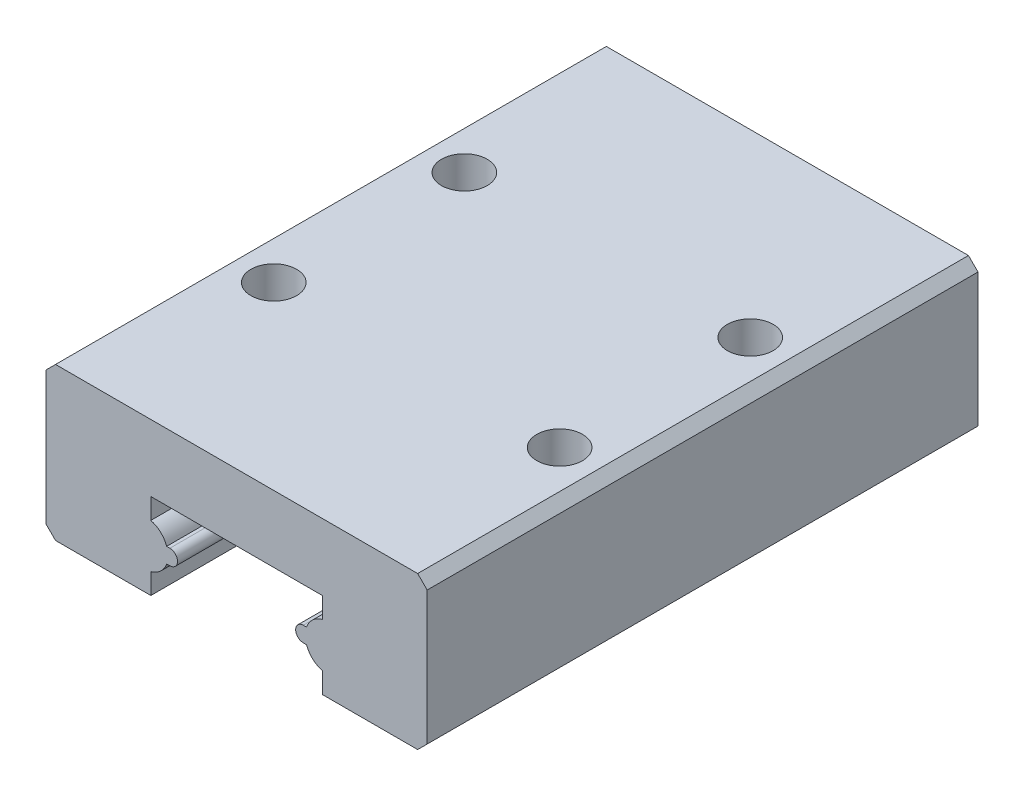
ISO-10303-21;
HEADER;
FILE_DESCRIPTION(('STEP AP214'),'2;1');
FILE_NAME('part.step','',(''),(''),'','','');
FILE_SCHEMA(('AUTOMOTIVE_DESIGN { 1 0 10303 214 1 1 1 1 }'));
ENDSEC;
DATA;
#1=APPLICATION_CONTEXT('core data for automotive mechanical design processes');
#2=APPLICATION_PROTOCOL_DEFINITION('international standard','automotive_design',2000,#1);
#3=PRODUCT_CONTEXT('',#1,'mechanical');
#4=PRODUCT('Part','Part','',(#3));
#5=PRODUCT_RELATED_PRODUCT_CATEGORY('part','',(#4));
#6=PRODUCT_DEFINITION_FORMATION('','',#4);
#7=PRODUCT_DEFINITION_CONTEXT('part definition',#1,'design');
#8=PRODUCT_DEFINITION('design','',#6,#7);
#9=PRODUCT_DEFINITION_SHAPE('','',#8);
#10=(LENGTH_UNIT() NAMED_UNIT(*) SI_UNIT(.MILLI.,.METRE.));
#11=(NAMED_UNIT(*) PLANE_ANGLE_UNIT() SI_UNIT($,.RADIAN.));
#12=(NAMED_UNIT(*) SI_UNIT($,.STERADIAN.) SOLID_ANGLE_UNIT());
#13=UNCERTAINTY_MEASURE_WITH_UNIT(LENGTH_MEASURE(1.E-05),#10,'distance_accuracy_value','');
#14=(GEOMETRIC_REPRESENTATION_CONTEXT(3) GLOBAL_UNCERTAINTY_ASSIGNED_CONTEXT((#13)) GLOBAL_UNIT_ASSIGNED_CONTEXT((#10,
#11,#12)) REPRESENTATION_CONTEXT('',''));
#15=CARTESIAN_POINT('',(0.,0.,0.));
#16=DIRECTION('',(0.,0.,1.));
#17=DIRECTION('',(1.,0.,0.));
#18=AXIS2_PLACEMENT_3D('',#15,#16,#17);
#19=CARTESIAN_POINT('',(14.5,3.41189500386223,28.9));
#20=DIRECTION('',(1.,0.,0.));
#21=DIRECTION('',(0.,1.,0.));
#22=AXIS2_PLACEMENT_3D('',#19,#20,#21);
#23=PLANE('',#22);
#24=DIRECTION('',(0.,-1.,0.));
#25=VECTOR('',#24,1.);
#26=CARTESIAN_POINT('',(14.5,3.41189500386223,0.));
#27=LINE('',#26,#25);
#28=CARTESIAN_POINT('',(14.5,4.5,0.));
#29=VERTEX_POINT('',#28);
#30=CARTESIAN_POINT('',(14.5,3.41189500386223,0.));
#31=VERTEX_POINT('',#30);
#32=EDGE_CURVE('E230',#29,#31,#27,.T.);
#33=ORIENTED_EDGE('',*,*,#32,.T.);
#34=DIRECTION('',(0.,0.,-1.));
#35=VECTOR('',#34,1.);
#36=CARTESIAN_POINT('',(14.5,3.41189500386223,28.9));
#37=LINE('',#36,#35);
#38=CARTESIAN_POINT('',(14.5,3.41189500386223,28.9));
#39=VERTEX_POINT('',#38);
#40=EDGE_CURVE('E11',#39,#31,#37,.T.);
#41=ORIENTED_EDGE('',*,*,#40,.F.);
#42=DIRECTION('',(0.,-1.,0.));
#43=VECTOR('',#42,1.);
#44=CARTESIAN_POINT('',(14.5,3.41189500386223,28.9));
#45=LINE('',#44,#43);
#46=CARTESIAN_POINT('',(14.5,4.5,28.9));
#47=VERTEX_POINT('',#46);
#48=EDGE_CURVE('E277',#47,#39,#45,.T.);
#49=ORIENTED_EDGE('',*,*,#48,.F.);
#50=DIRECTION('',(0.,0.,-1.));
#51=VECTOR('',#50,1.);
#52=CARTESIAN_POINT('',(14.5,4.5,28.9));
#53=LINE('',#52,#51);
#54=EDGE_CURVE('E226',#47,#29,#53,.T.);
#55=ORIENTED_EDGE('',*,*,#54,.T.);
#56=EDGE_LOOP('',(#33,#41,#49,#55));
#57=FACE_BOUND('',#56,.T.);
#58=ADVANCED_FACE('F38',(#57),#23,.F.);
#59=CARTESIAN_POINT('',(14.8,2.25,28.9));
#60=DIRECTION('',(0.,0.,-1.));
#61=DIRECTION('',(-1.,0.,0.));
#62=AXIS2_PLACEMENT_3D('',#59,#60,#61);
#63=CYLINDRICAL_SURFACE('',#62,1.2);
#64=CARTESIAN_POINT('',(14.8,2.25,0.));
#65=DIRECTION('',(0.,0.,1.));
#66=DIRECTION('',(-1.,0.,0.));
#67=AXIS2_PLACEMENT_3D('',#64,#65,#66);
#68=CIRCLE('',#67,1.2);
#69=CARTESIAN_POINT('',(13.6686291501015,2.65,0.));
#70=VERTEX_POINT('',#69);
#71=EDGE_CURVE('E233',#31,#70,#68,.T.);
#72=ORIENTED_EDGE('',*,*,#71,.T.);
#73=DIRECTION('',(0.,0.,-1.));
#74=VECTOR('',#73,1.);
#75=CARTESIAN_POINT('',(13.6686291501015,2.65,28.9));
#76=LINE('',#75,#74);
#77=CARTESIAN_POINT('',(13.6686291501015,2.65,28.9));
#78=VERTEX_POINT('',#77);
#79=EDGE_CURVE('E46',#78,#70,#76,.T.);
#80=ORIENTED_EDGE('',*,*,#79,.F.);
#81=CARTESIAN_POINT('',(14.8,2.25,28.9));
#82=DIRECTION('',(0.,0.,1.));
#83=DIRECTION('',(-1.,0.,0.));
#84=AXIS2_PLACEMENT_3D('',#81,#82,#83);
#85=CIRCLE('',#84,1.2);
#86=EDGE_CURVE('E145',#39,#78,#85,.T.);
#87=ORIENTED_EDGE('',*,*,#86,.F.);
#88=ORIENTED_EDGE('',*,*,#40,.T.);
#89=EDGE_LOOP('',(#72,#80,#87,#88));
#90=FACE_BOUND('',#89,.T.);
#91=ADVANCED_FACE('F415',(#90),#63,.T.);
#92=CARTESIAN_POINT('',(13.5,2.65,28.9));
#93=DIRECTION('',(0.,-1.,0.));
#94=DIRECTION('',(1.,0.,0.));
#95=AXIS2_PLACEMENT_3D('',#92,#93,#94);
#96=PLANE('',#95);
#97=DIRECTION('',(-1.,0.,0.));
#98=VECTOR('',#97,1.);
#99=CARTESIAN_POINT('',(13.5,2.65,0.));
#100=LINE('',#99,#98);
#101=CARTESIAN_POINT('',(13.5,2.65,0.));
#102=VERTEX_POINT('',#101);
#103=EDGE_CURVE('E236',#70,#102,#100,.T.);
#104=ORIENTED_EDGE('',*,*,#103,.T.);
#105=DIRECTION('',(0.,0.,-1.));
#106=VECTOR('',#105,1.);
#107=CARTESIAN_POINT('',(13.5,2.65,28.9));
#108=LINE('',#107,#106);
#109=CARTESIAN_POINT('',(13.5,2.65,28.9));
#110=VERTEX_POINT('',#109);
#111=EDGE_CURVE('E332',#110,#102,#108,.T.);
#112=ORIENTED_EDGE('',*,*,#111,.F.);
#113=DIRECTION('',(-1.,0.,0.));
#114=VECTOR('',#113,1.);
#115=CARTESIAN_POINT('',(13.5,2.65,28.9));
#116=LINE('',#115,#114);
#117=EDGE_CURVE('E340',#78,#110,#116,.T.);
#118=ORIENTED_EDGE('',*,*,#117,.F.);
#119=ORIENTED_EDGE('',*,*,#79,.T.);
#120=EDGE_LOOP('',(#104,#112,#118,#119));
#121=FACE_BOUND('',#120,.T.);
#122=ADVANCED_FACE('F338',(#121),#96,.F.);
#123=CARTESIAN_POINT('',(13.5,2.25,28.9));
#124=DIRECTION('',(0.,0.,-1.));
#125=DIRECTION('',(-1.,0.,0.));
#126=AXIS2_PLACEMENT_3D('',#123,#124,#125);
#127=CYLINDRICAL_SURFACE('',#126,0.4);
#128=CARTESIAN_POINT('',(13.5,2.25,0.));
#129=DIRECTION('',(0.,0.,1.));
#130=DIRECTION('',(-1.,0.,0.));
#131=AXIS2_PLACEMENT_3D('',#128,#129,#130);
#132=CIRCLE('',#131,0.4);
#133=CARTESIAN_POINT('',(13.5,1.85,0.));
#134=VERTEX_POINT('',#133);
#135=EDGE_CURVE('E238',#102,#134,#132,.T.);
#136=ORIENTED_EDGE('',*,*,#135,.T.);
#137=DIRECTION('',(0.,0.,-1.));
#138=VECTOR('',#137,1.);
#139=CARTESIAN_POINT('',(13.5,1.85,28.9));
#140=LINE('',#139,#138);
#141=CARTESIAN_POINT('',(13.5,1.85,28.9));
#142=VERTEX_POINT('',#141);
#143=EDGE_CURVE('E329',#142,#134,#140,.T.);
#144=ORIENTED_EDGE('',*,*,#143,.F.);
#145=CARTESIAN_POINT('',(13.5,2.25,28.9));
#146=DIRECTION('',(0.,0.,1.));
#147=DIRECTION('',(-1.,0.,0.));
#148=AXIS2_PLACEMENT_3D('',#145,#146,#147);
#149=CIRCLE('',#148,0.4);
#150=EDGE_CURVE('E358',#110,#142,#149,.T.);
#151=ORIENTED_EDGE('',*,*,#150,.F.);
#152=ORIENTED_EDGE('',*,*,#111,.T.);
#153=EDGE_LOOP('',(#136,#144,#151,#152));
#154=FACE_BOUND('',#153,.T.);
#155=ADVANCED_FACE('F349',(#154),#127,.T.);
#156=CARTESIAN_POINT('',(13.5,1.85,28.9));
#157=DIRECTION('',(0.,1.,0.));
#158=DIRECTION('',(-1.,0.,0.));
#159=AXIS2_PLACEMENT_3D('',#156,#157,#158);
#160=PLANE('',#159);
#161=DIRECTION('',(1.,0.,0.));
#162=VECTOR('',#161,1.);
#163=CARTESIAN_POINT('',(13.5,1.85,0.));
#164=LINE('',#163,#162);
#165=CARTESIAN_POINT('',(13.6686291501015,1.85,0.));
#166=VERTEX_POINT('',#165);
#167=EDGE_CURVE('E240',#134,#166,#164,.T.);
#168=ORIENTED_EDGE('',*,*,#167,.T.);
#169=DIRECTION('',(0.,0.,-1.));
#170=VECTOR('',#169,1.);
#171=CARTESIAN_POINT('',(13.6686291501015,1.85,28.9));
#172=LINE('',#171,#170);
#173=CARTESIAN_POINT('',(13.6686291501015,1.85,28.9));
#174=VERTEX_POINT('',#173);
#175=EDGE_CURVE('E326',#174,#166,#172,.T.);
#176=ORIENTED_EDGE('',*,*,#175,.F.);
#177=DIRECTION('',(1.,0.,0.));
#178=VECTOR('',#177,1.);
#179=CARTESIAN_POINT('',(13.5,1.85,28.9));
#180=LINE('',#179,#178);
#181=EDGE_CURVE('E355',#142,#174,#180,.T.);
#182=ORIENTED_EDGE('',*,*,#181,.F.);
#183=ORIENTED_EDGE('',*,*,#143,.T.);
#184=EDGE_LOOP('',(#168,#176,#182,#183));
#185=FACE_BOUND('',#184,.T.);
#186=ADVANCED_FACE('F353',(#185),#160,.F.);
#187=CARTESIAN_POINT('',(14.8,2.25,28.9));
#188=DIRECTION('',(0.,0.,-1.));
#189=DIRECTION('',(-1.,0.,0.));
#190=AXIS2_PLACEMENT_3D('',#187,#188,#189);
#191=CYLINDRICAL_SURFACE('',#190,1.2);
#192=CARTESIAN_POINT('',(14.8,2.25,0.));
#193=DIRECTION('',(0.,0.,1.));
#194=DIRECTION('',(-1.,0.,0.));
#195=AXIS2_PLACEMENT_3D('',#192,#193,#194);
#196=CIRCLE('',#195,1.2);
#197=CARTESIAN_POINT('',(14.5,1.08810499613778,0.));
#198=VERTEX_POINT('',#197);
#199=EDGE_CURVE('E242',#166,#198,#196,.T.);
#200=ORIENTED_EDGE('',*,*,#199,.T.);
#201=DIRECTION('',(0.,0.,-1.));
#202=VECTOR('',#201,1.);
#203=CARTESIAN_POINT('',(14.5,1.08810499613778,28.9));
#204=LINE('',#203,#202);
#205=CARTESIAN_POINT('',(14.5,1.08810499613778,28.9));
#206=VERTEX_POINT('',#205);
#207=EDGE_CURVE('E323',#206,#198,#204,.T.);
#208=ORIENTED_EDGE('',*,*,#207,.F.);
#209=CARTESIAN_POINT('',(14.8,2.25,28.9));
#210=DIRECTION('',(0.,0.,1.));
#211=DIRECTION('',(-1.,0.,0.));
#212=AXIS2_PLACEMENT_3D('',#209,#210,#211);
#213=CIRCLE('',#212,1.2);
#214=EDGE_CURVE('E357',#174,#206,#213,.T.);
#215=ORIENTED_EDGE('',*,*,#214,.F.);
#216=ORIENTED_EDGE('',*,*,#175,.T.);
#217=EDGE_LOOP('',(#200,#208,#215,#216));
#218=FACE_BOUND('',#217,.T.);
#219=ADVANCED_FACE('F428',(#218),#191,.T.);
#220=CARTESIAN_POINT('',(14.5,0.,28.9));
#221=DIRECTION('',(1.,0.,0.));
#222=DIRECTION('',(0.,1.,0.));
#223=AXIS2_PLACEMENT_3D('',#220,#221,#222);
#224=PLANE('',#223);
#225=DIRECTION('',(0.,-1.,0.));
#226=VECTOR('',#225,1.);
#227=CARTESIAN_POINT('',(14.5,0.,0.));
#228=LINE('',#227,#226);
#229=CARTESIAN_POINT('',(14.5,0.,0.));
#230=VERTEX_POINT('',#229);
#231=EDGE_CURVE('E244',#198,#230,#228,.T.);
#232=ORIENTED_EDGE('',*,*,#231,.T.);
#233=DIRECTION('',(0.,0.,-1.));
#234=VECTOR('',#233,1.);
#235=CARTESIAN_POINT('',(14.5,0.,28.9));
#236=LINE('',#235,#234);
#237=CARTESIAN_POINT('',(14.5,0.,28.9));
#238=VERTEX_POINT('',#237);
#239=EDGE_CURVE('E320',#238,#230,#236,.T.);
#240=ORIENTED_EDGE('',*,*,#239,.F.);
#241=DIRECTION('',(0.,-1.,0.));
#242=VECTOR('',#241,1.);
#243=CARTESIAN_POINT('',(14.5,0.,28.9));
#244=LINE('',#243,#242);
#245=EDGE_CURVE('E360',#206,#238,#244,.T.);
#246=ORIENTED_EDGE('',*,*,#245,.F.);
#247=ORIENTED_EDGE('',*,*,#207,.T.);
#248=EDGE_LOOP('',(#232,#240,#246,#247));
#249=FACE_BOUND('',#248,.T.);
#250=ADVANCED_FACE('F431',(#249),#224,.F.);
#251=CARTESIAN_POINT('',(19.5,0.,28.9));
#252=DIRECTION('',(0.,1.,0.));
#253=DIRECTION('',(0.,0.,1.));
#254=AXIS2_PLACEMENT_3D('',#251,#252,#253);
#255=PLANE('',#254);
#256=DIRECTION('',(1.,0.,0.));
#257=VECTOR('',#256,1.);
#258=CARTESIAN_POINT('',(19.5,0.,0.));
#259=LINE('',#258,#257);
#260=CARTESIAN_POINT('',(19.5,0.,0.));
#261=VERTEX_POINT('',#260);
#262=EDGE_CURVE('E246',#230,#261,#259,.T.);
#263=ORIENTED_EDGE('',*,*,#262,.T.);
#264=DIRECTION('',(0.,0.,-1.));
#265=VECTOR('',#264,1.);
#266=CARTESIAN_POINT('',(19.5,0.,28.9));
#267=LINE('',#266,#265);
#268=CARTESIAN_POINT('',(19.5,0.,28.9));
#269=VERTEX_POINT('',#268);
#270=EDGE_CURVE('E317',#269,#261,#267,.T.);
#271=ORIENTED_EDGE('',*,*,#270,.F.);
#272=DIRECTION('',(1.,0.,0.));
#273=VECTOR('',#272,1.);
#274=CARTESIAN_POINT('',(19.5,0.,28.9));
#275=LINE('',#274,#273);
#276=EDGE_CURVE('E366',#238,#269,#275,.T.);
#277=ORIENTED_EDGE('',*,*,#276,.F.);
#278=ORIENTED_EDGE('',*,*,#239,.T.);
#279=EDGE_LOOP('',(#263,#271,#277,#278));
#280=FACE_BOUND('',#279,.T.);
#281=ADVANCED_FACE('F435',(#280),#255,.F.);
#282=CARTESIAN_POINT('',(19.5,0.,28.9));
#283=DIRECTION('',(-0.707106781186547,0.707106781186548,0.));
#284=DIRECTION('',(-0.707106781186548,-0.707106781186547,0.));
#285=AXIS2_PLACEMENT_3D('',#282,#283,#284);
#286=PLANE('',#285);
#287=DIRECTION('',(0.707106781186548,0.707106781186547,0.));
#288=VECTOR('',#287,1.);
#289=CARTESIAN_POINT('',(19.5,0.,0.));
#290=LINE('',#289,#288);
#291=CARTESIAN_POINT('',(20.,0.5,0.));
#292=VERTEX_POINT('',#291);
#293=EDGE_CURVE('E248',#261,#292,#290,.T.);
#294=ORIENTED_EDGE('',*,*,#293,.T.);
#295=DIRECTION('',(0.,0.,-1.));
#296=VECTOR('',#295,1.);
#297=CARTESIAN_POINT('',(20.,0.5,28.9));
#298=LINE('',#297,#296);
#299=CARTESIAN_POINT('',(20.,0.5,28.9));
#300=VERTEX_POINT('',#299);
#301=EDGE_CURVE('E314',#300,#292,#298,.T.);
#302=ORIENTED_EDGE('',*,*,#301,.F.);
#303=DIRECTION('',(0.707106781186548,0.707106781186547,0.));
#304=VECTOR('',#303,1.);
#305=CARTESIAN_POINT('',(19.5,0.,28.9));
#306=LINE('',#305,#304);
#307=EDGE_CURVE('E368',#269,#300,#306,.T.);
#308=ORIENTED_EDGE('',*,*,#307,.F.);
#309=ORIENTED_EDGE('',*,*,#270,.T.);
#310=EDGE_LOOP('',(#294,#302,#308,#309));
#311=FACE_BOUND('',#310,.T.);
#312=ADVANCED_FACE('F439',(#311),#286,.F.);
#313=CARTESIAN_POINT('',(20.,0.5,28.9));
#314=DIRECTION('',(-1.,0.,0.));
#315=DIRECTION('',(0.,0.,1.));
#316=AXIS2_PLACEMENT_3D('',#313,#314,#315);
#317=PLANE('',#316);
#318=DIRECTION('',(0.,1.,0.));
#319=VECTOR('',#318,1.);
#320=CARTESIAN_POINT('',(20.,0.5,0.));
#321=LINE('',#320,#319);
#322=CARTESIAN_POINT('',(20.,7.5,0.));
#323=VERTEX_POINT('',#322);
#324=EDGE_CURVE('E250',#292,#323,#321,.T.);
#325=ORIENTED_EDGE('',*,*,#324,.T.);
#326=DIRECTION('',(0.,0.,-1.));
#327=VECTOR('',#326,1.);
#328=CARTESIAN_POINT('',(20.,7.5,28.9));
#329=LINE('',#328,#327);
#330=CARTESIAN_POINT('',(20.,7.5,28.9));
#331=VERTEX_POINT('',#330);
#332=EDGE_CURVE('E311',#331,#323,#329,.T.);
#333=ORIENTED_EDGE('',*,*,#332,.F.);
#334=DIRECTION('',(0.,1.,0.));
#335=VECTOR('',#334,1.);
#336=CARTESIAN_POINT('',(20.,0.5,28.9));
#337=LINE('',#336,#335);
#338=EDGE_CURVE('E370',#300,#331,#337,.T.);
#339=ORIENTED_EDGE('',*,*,#338,.F.);
#340=ORIENTED_EDGE('',*,*,#301,.T.);
#341=EDGE_LOOP('',(#325,#333,#339,#340));
#342=FACE_BOUND('',#341,.T.);
#343=ADVANCED_FACE('F443',(#342),#317,.F.);
#344=CARTESIAN_POINT('',(19.5,8.,28.9));
#345=DIRECTION('',(-0.707106781186549,-0.707106781186546,0.));
#346=DIRECTION('',(0.707106781186546,-0.707106781186549,0.));
#347=AXIS2_PLACEMENT_3D('',#344,#345,#346);
#348=PLANE('',#347);
#349=DIRECTION('',(-0.707106781186546,0.707106781186549,0.));
#350=VECTOR('',#349,1.);
#351=CARTESIAN_POINT('',(19.5,8.,0.));
#352=LINE('',#351,#350);
#353=CARTESIAN_POINT('',(19.5,8.,0.));
#354=VERTEX_POINT('',#353);
#355=EDGE_CURVE('E252',#323,#354,#352,.T.);
#356=ORIENTED_EDGE('',*,*,#355,.T.);
#357=DIRECTION('',(0.,0.,-1.));
#358=VECTOR('',#357,1.);
#359=CARTESIAN_POINT('',(19.5,8.,28.9));
#360=LINE('',#359,#358);
#361=CARTESIAN_POINT('',(19.5,8.,28.9));
#362=VERTEX_POINT('',#361);
#363=EDGE_CURVE('E308',#362,#354,#360,.T.);
#364=ORIENTED_EDGE('',*,*,#363,.F.);
#365=DIRECTION('',(-0.707106781186546,0.707106781186549,0.));
#366=VECTOR('',#365,1.);
#367=CARTESIAN_POINT('',(19.5,8.,28.9));
#368=LINE('',#367,#366);
#369=EDGE_CURVE('E372',#331,#362,#368,.T.);
#370=ORIENTED_EDGE('',*,*,#369,.F.);
#371=ORIENTED_EDGE('',*,*,#332,.T.);
#372=EDGE_LOOP('',(#356,#364,#370,#371));
#373=FACE_BOUND('',#372,.T.);
#374=ADVANCED_FACE('F447',(#373),#348,.F.);
#375=CARTESIAN_POINT('',(0.5,8.,28.9));
#376=DIRECTION('',(0.,-1.,0.));
#377=DIRECTION('',(1.,0.,0.));
#378=AXIS2_PLACEMENT_3D('',#375,#376,#377);
#379=PLANE('',#378);
#380=CARTESIAN_POINT('',(17.5,8.,19.45));
#381=DIRECTION('',(0.,1.,0.));
#382=DIRECTION('',(0.,0.,1.));
#383=AXIS2_PLACEMENT_3D('',#380,#381,#382);
#384=CIRCLE('',#383,1.2);
#385=CARTESIAN_POINT('',(17.5,8.,20.65));
#386=VERTEX_POINT('',#385);
#387=EDGE_CURVE('E610',#386,#386,#384,.T.);
#388=ORIENTED_EDGE('',*,*,#387,.F.);
#389=EDGE_LOOP('',(#388));
#390=FACE_BOUND('',#389,.T.);
#391=CARTESIAN_POINT('',(17.5,8.,9.45));
#392=DIRECTION('',(0.,1.,0.));
#393=DIRECTION('',(0.,0.,1.));
#394=AXIS2_PLACEMENT_3D('',#391,#392,#393);
#395=CIRCLE('',#394,1.2);
#396=CARTESIAN_POINT('',(17.5,8.,10.65));
#397=VERTEX_POINT('',#396);
#398=EDGE_CURVE('E609',#397,#397,#395,.T.);
#399=ORIENTED_EDGE('',*,*,#398,.F.);
#400=EDGE_LOOP('',(#399));
#401=FACE_BOUND('',#400,.T.);
#402=CARTESIAN_POINT('',(2.5,8.,9.45));
#403=DIRECTION('',(0.,1.,0.));
#404=DIRECTION('',(0.,0.,1.));
#405=AXIS2_PLACEMENT_3D('',#402,#403,#404);
#406=CIRCLE('',#405,1.2);
#407=CARTESIAN_POINT('',(2.5,8.,10.65));
#408=VERTEX_POINT('',#407);
#409=EDGE_CURVE('E629',#408,#408,#406,.T.);
#410=ORIENTED_EDGE('',*,*,#409,.F.);
#411=EDGE_LOOP('',(#410));
#412=FACE_BOUND('',#411,.T.);
#413=CARTESIAN_POINT('',(2.5,8.,19.45));
#414=DIRECTION('',(0.,1.,0.));
#415=DIRECTION('',(0.,0.,1.));
#416=AXIS2_PLACEMENT_3D('',#413,#414,#415);
#417=CIRCLE('',#416,1.2);
#418=CARTESIAN_POINT('',(2.5,8.,20.65));
#419=VERTEX_POINT('',#418);
#420=EDGE_CURVE('E621',#419,#419,#417,.T.);
#421=ORIENTED_EDGE('',*,*,#420,.F.);
#422=EDGE_LOOP('',(#421));
#423=FACE_BOUND('',#422,.T.);
#424=DIRECTION('',(-1.,0.,0.));
#425=VECTOR('',#424,1.);
#426=CARTESIAN_POINT('',(0.5,8.,0.));
#427=LINE('',#426,#425);
#428=CARTESIAN_POINT('',(0.5,8.,0.));
#429=VERTEX_POINT('',#428);
#430=EDGE_CURVE('E254',#354,#429,#427,.T.);
#431=ORIENTED_EDGE('',*,*,#430,.T.);
#432=DIRECTION('',(0.,0.,-1.));
#433=VECTOR('',#432,1.);
#434=CARTESIAN_POINT('',(0.5,8.,28.9));
#435=LINE('',#434,#433);
#436=CARTESIAN_POINT('',(0.5,8.,28.9));
#437=VERTEX_POINT('',#436);
#438=EDGE_CURVE('E305',#437,#429,#435,.T.);
#439=ORIENTED_EDGE('',*,*,#438,.F.);
#440=DIRECTION('',(-1.,0.,0.));
#441=VECTOR('',#440,1.);
#442=CARTESIAN_POINT('',(0.5,8.,28.9));
#443=LINE('',#442,#441);
#444=EDGE_CURVE('E374',#362,#437,#443,.T.);
#445=ORIENTED_EDGE('',*,*,#444,.F.);
#446=ORIENTED_EDGE('',*,*,#363,.T.);
#447=EDGE_LOOP('',(#431,#439,#445,#446));
#448=FACE_BOUND('',#447,.T.);
#449=ADVANCED_FACE('F451',(#390,#401,#412,#423,#448),#379,.F.);
#450=CARTESIAN_POINT('',(0.,7.5,28.9));
#451=DIRECTION('',(0.707106781186548,-0.707106781186547,0.));
#452=DIRECTION('',(0.707106781186547,0.707106781186548,0.));
#453=AXIS2_PLACEMENT_3D('',#450,#451,#452);
#454=PLANE('',#453);
#455=DIRECTION('',(-0.707106781186547,-0.707106781186548,0.));
#456=VECTOR('',#455,1.);
#457=CARTESIAN_POINT('',(0.,7.5,0.));
#458=LINE('',#457,#456);
#459=CARTESIAN_POINT('',(0.,7.5,0.));
#460=VERTEX_POINT('',#459);
#461=EDGE_CURVE('E256',#429,#460,#458,.T.);
#462=ORIENTED_EDGE('',*,*,#461,.T.);
#463=DIRECTION('',(0.,0.,-1.));
#464=VECTOR('',#463,1.);
#465=CARTESIAN_POINT('',(0.,7.5,28.9));
#466=LINE('',#465,#464);
#467=CARTESIAN_POINT('',(0.,7.5,28.9));
#468=VERTEX_POINT('',#467);
#469=EDGE_CURVE('E302',#468,#460,#466,.T.);
#470=ORIENTED_EDGE('',*,*,#469,.F.);
#471=DIRECTION('',(-0.707106781186547,-0.707106781186548,0.));
#472=VECTOR('',#471,1.);
#473=CARTESIAN_POINT('',(0.,7.5,28.9));
#474=LINE('',#473,#472);
#475=EDGE_CURVE('E376',#437,#468,#474,.T.);
#476=ORIENTED_EDGE('',*,*,#475,.F.);
#477=ORIENTED_EDGE('',*,*,#438,.T.);
#478=EDGE_LOOP('',(#462,#470,#476,#477));
#479=FACE_BOUND('',#478,.T.);
#480=ADVANCED_FACE('F455',(#479),#454,.F.);
#481=CARTESIAN_POINT('',(0.,0.5,28.9));
#482=DIRECTION('',(1.,0.,0.));
#483=DIRECTION('',(0.,0.,-1.));
#484=AXIS2_PLACEMENT_3D('',#481,#482,#483);
#485=PLANE('',#484);
#486=DIRECTION('',(0.,-1.,0.));
#487=VECTOR('',#486,1.);
#488=CARTESIAN_POINT('',(0.,0.5,0.));
#489=LINE('',#488,#487);
#490=CARTESIAN_POINT('',(0.,0.5,0.));
#491=VERTEX_POINT('',#490);
#492=EDGE_CURVE('E258',#460,#491,#489,.T.);
#493=ORIENTED_EDGE('',*,*,#492,.T.);
#494=DIRECTION('',(0.,0.,-1.));
#495=VECTOR('',#494,1.);
#496=CARTESIAN_POINT('',(0.,0.5,28.9));
#497=LINE('',#496,#495);
#498=CARTESIAN_POINT('',(0.,0.5,28.9));
#499=VERTEX_POINT('',#498);
#500=EDGE_CURVE('E299',#499,#491,#497,.T.);
#501=ORIENTED_EDGE('',*,*,#500,.F.);
#502=DIRECTION('',(0.,-1.,0.));
#503=VECTOR('',#502,1.);
#504=CARTESIAN_POINT('',(0.,0.5,28.9));
#505=LINE('',#504,#503);
#506=EDGE_CURVE('E378',#468,#499,#505,.T.);
#507=ORIENTED_EDGE('',*,*,#506,.F.);
#508=ORIENTED_EDGE('',*,*,#469,.T.);
#509=EDGE_LOOP('',(#493,#501,#507,#508));
#510=FACE_BOUND('',#509,.T.);
#511=ADVANCED_FACE('F459',(#510),#485,.F.);
#512=CARTESIAN_POINT('',(0.,0.5,28.9));
#513=DIRECTION('',(0.707106781186548,0.707106781186548,0.));
#514=DIRECTION('',(-0.707106781186548,0.707106781186548,0.));
#515=AXIS2_PLACEMENT_3D('',#512,#513,#514);
#516=PLANE('',#515);
#517=DIRECTION('',(0.707106781186548,-0.707106781186548,0.));
#518=VECTOR('',#517,1.);
#519=CARTESIAN_POINT('',(0.,0.5,0.));
#520=LINE('',#519,#518);
#521=CARTESIAN_POINT('',(0.5,0.,0.));
#522=VERTEX_POINT('',#521);
#523=EDGE_CURVE('E260',#491,#522,#520,.T.);
#524=ORIENTED_EDGE('',*,*,#523,.T.);
#525=DIRECTION('',(0.,0.,-1.));
#526=VECTOR('',#525,1.);
#527=CARTESIAN_POINT('',(0.5,0.,28.9));
#528=LINE('',#527,#526);
#529=CARTESIAN_POINT('',(0.5,0.,28.9));
#530=VERTEX_POINT('',#529);
#531=EDGE_CURVE('E296',#530,#522,#528,.T.);
#532=ORIENTED_EDGE('',*,*,#531,.F.);
#533=DIRECTION('',(0.707106781186548,-0.707106781186548,0.));
#534=VECTOR('',#533,1.);
#535=CARTESIAN_POINT('',(0.,0.5,28.9));
#536=LINE('',#535,#534);
#537=EDGE_CURVE('E380',#499,#530,#536,.T.);
#538=ORIENTED_EDGE('',*,*,#537,.F.);
#539=ORIENTED_EDGE('',*,*,#500,.T.);
#540=EDGE_LOOP('',(#524,#532,#538,#539));
#541=FACE_BOUND('',#540,.T.);
#542=ADVANCED_FACE('F463',(#541),#516,.F.);
#543=CARTESIAN_POINT('',(0.5,0.,28.9));
#544=DIRECTION('',(0.,1.,0.));
#545=DIRECTION('',(-1.,0.,0.));
#546=AXIS2_PLACEMENT_3D('',#543,#544,#545);
#547=PLANE('',#546);
#548=DIRECTION('',(1.,0.,0.));
#549=VECTOR('',#548,1.);
#550=CARTESIAN_POINT('',(0.5,0.,0.));
#551=LINE('',#550,#549);
#552=CARTESIAN_POINT('',(5.5,0.,0.));
#553=VERTEX_POINT('',#552);
#554=EDGE_CURVE('E262',#522,#553,#551,.T.);
#555=ORIENTED_EDGE('',*,*,#554,.T.);
#556=DIRECTION('',(0.,0.,-1.));
#557=VECTOR('',#556,1.);
#558=CARTESIAN_POINT('',(5.5,0.,28.9));
#559=LINE('',#558,#557);
#560=CARTESIAN_POINT('',(5.5,0.,28.9));
#561=VERTEX_POINT('',#560);
#562=EDGE_CURVE('E293',#561,#553,#559,.T.);
#563=ORIENTED_EDGE('',*,*,#562,.F.);
#564=DIRECTION('',(1.,0.,0.));
#565=VECTOR('',#564,1.);
#566=CARTESIAN_POINT('',(0.5,0.,28.9));
#567=LINE('',#566,#565);
#568=EDGE_CURVE('E382',#530,#561,#567,.T.);
#569=ORIENTED_EDGE('',*,*,#568,.F.);
#570=ORIENTED_EDGE('',*,*,#531,.T.);
#571=EDGE_LOOP('',(#555,#563,#569,#570));
#572=FACE_BOUND('',#571,.T.);
#573=ADVANCED_FACE('F467',(#572),#547,.F.);
#574=CARTESIAN_POINT('',(5.5,1.08810499613778,28.9));
#575=DIRECTION('',(-1.,0.,0.));
#576=DIRECTION('',(0.,-1.,0.));
#577=AXIS2_PLACEMENT_3D('',#574,#575,#576);
#578=PLANE('',#577);
#579=DIRECTION('',(0.,1.,0.));
#580=VECTOR('',#579,1.);
#581=CARTESIAN_POINT('',(5.5,1.08810499613778,0.));
#582=LINE('',#581,#580);
#583=CARTESIAN_POINT('',(5.5,1.08810499613778,0.));
#584=VERTEX_POINT('',#583);
#585=EDGE_CURVE('E264',#553,#584,#582,.T.);
#586=ORIENTED_EDGE('',*,*,#585,.T.);
#587=DIRECTION('',(0.,0.,-1.));
#588=VECTOR('',#587,1.);
#589=CARTESIAN_POINT('',(5.5,1.08810499613778,28.9));
#590=LINE('',#589,#588);
#591=CARTESIAN_POINT('',(5.5,1.08810499613778,28.9));
#592=VERTEX_POINT('',#591);
#593=EDGE_CURVE('E290',#592,#584,#590,.T.);
#594=ORIENTED_EDGE('',*,*,#593,.F.);
#595=DIRECTION('',(0.,1.,0.));
#596=VECTOR('',#595,1.);
#597=CARTESIAN_POINT('',(5.5,1.08810499613778,28.9));
#598=LINE('',#597,#596);
#599=EDGE_CURVE('E384',#561,#592,#598,.T.);
#600=ORIENTED_EDGE('',*,*,#599,.F.);
#601=ORIENTED_EDGE('',*,*,#562,.T.);
#602=EDGE_LOOP('',(#586,#594,#600,#601));
#603=FACE_BOUND('',#602,.T.);
#604=ADVANCED_FACE('F471',(#603),#578,.F.);
#605=CARTESIAN_POINT('',(5.2,2.25,28.9));
#606=DIRECTION('',(0.,0.,-1.));
#607=DIRECTION('',(-1.,0.,0.));
#608=AXIS2_PLACEMENT_3D('',#605,#606,#607);
#609=CYLINDRICAL_SURFACE('',#608,1.2);
#610=CARTESIAN_POINT('',(5.2,2.25,0.));
#611=DIRECTION('',(0.,0.,1.));
#612=DIRECTION('',(1.,0.,0.));
#613=AXIS2_PLACEMENT_3D('',#610,#611,#612);
#614=CIRCLE('',#613,1.2);
#615=CARTESIAN_POINT('',(6.33137084989848,1.85,0.));
#616=VERTEX_POINT('',#615);
#617=EDGE_CURVE('E266',#584,#616,#614,.T.);
#618=ORIENTED_EDGE('',*,*,#617,.T.);
#619=DIRECTION('',(0.,0.,-1.));
#620=VECTOR('',#619,1.);
#621=CARTESIAN_POINT('',(6.33137084989848,1.85,28.9));
#622=LINE('',#621,#620);
#623=CARTESIAN_POINT('',(6.33137084989848,1.85,28.9));
#624=VERTEX_POINT('',#623);
#625=EDGE_CURVE('E287',#624,#616,#622,.T.);
#626=ORIENTED_EDGE('',*,*,#625,.F.);
#627=CARTESIAN_POINT('',(5.2,2.25,28.9));
#628=DIRECTION('',(0.,0.,1.));
#629=DIRECTION('',(1.,0.,0.));
#630=AXIS2_PLACEMENT_3D('',#627,#628,#629);
#631=CIRCLE('',#630,1.2);
#632=EDGE_CURVE('E386',#592,#624,#631,.T.);
#633=ORIENTED_EDGE('',*,*,#632,.F.);
#634=ORIENTED_EDGE('',*,*,#593,.T.);
#635=EDGE_LOOP('',(#618,#626,#633,#634));
#636=FACE_BOUND('',#635,.T.);
#637=ADVANCED_FACE('F475',(#636),#609,.T.);
#638=CARTESIAN_POINT('',(6.5,1.85,28.9));
#639=DIRECTION('',(0.,1.,0.));
#640=DIRECTION('',(-1.,0.,0.));
#641=AXIS2_PLACEMENT_3D('',#638,#639,#640);
#642=PLANE('',#641);
#643=DIRECTION('',(1.,0.,0.));
#644=VECTOR('',#643,1.);
#645=CARTESIAN_POINT('',(6.5,1.85,0.));
#646=LINE('',#645,#644);
#647=CARTESIAN_POINT('',(6.5,1.85,0.));
#648=VERTEX_POINT('',#647);
#649=EDGE_CURVE('E268',#616,#648,#646,.T.);
#650=ORIENTED_EDGE('',*,*,#649,.T.);
#651=DIRECTION('',(0.,0.,-1.));
#652=VECTOR('',#651,1.);
#653=CARTESIAN_POINT('',(6.5,1.85,28.9));
#654=LINE('',#653,#652);
#655=CARTESIAN_POINT('',(6.5,1.85,28.9));
#656=VERTEX_POINT('',#655);
#657=EDGE_CURVE('E284',#656,#648,#654,.T.);
#658=ORIENTED_EDGE('',*,*,#657,.F.);
#659=DIRECTION('',(1.,0.,0.));
#660=VECTOR('',#659,1.);
#661=CARTESIAN_POINT('',(6.5,1.85,28.9));
#662=LINE('',#661,#660);
#663=EDGE_CURVE('E388',#624,#656,#662,.T.);
#664=ORIENTED_EDGE('',*,*,#663,.F.);
#665=ORIENTED_EDGE('',*,*,#625,.T.);
#666=EDGE_LOOP('',(#650,#658,#664,#665));
#667=FACE_BOUND('',#666,.T.);
#668=ADVANCED_FACE('F479',(#667),#642,.F.);
#669=CARTESIAN_POINT('',(6.5,2.25,28.9));
#670=DIRECTION('',(0.,0.,-1.));
#671=DIRECTION('',(-1.,0.,0.));
#672=AXIS2_PLACEMENT_3D('',#669,#670,#671);
#673=CYLINDRICAL_SURFACE('',#672,0.4);
#674=CARTESIAN_POINT('',(6.5,2.25,0.));
#675=DIRECTION('',(0.,0.,1.));
#676=DIRECTION('',(1.,0.,0.));
#677=AXIS2_PLACEMENT_3D('',#674,#675,#676);
#678=CIRCLE('',#677,0.4);
#679=CARTESIAN_POINT('',(6.5,2.65,0.));
#680=VERTEX_POINT('',#679);
#681=EDGE_CURVE('E270',#648,#680,#678,.T.);
#682=ORIENTED_EDGE('',*,*,#681,.T.);
#683=DIRECTION('',(0.,0.,-1.));
#684=VECTOR('',#683,1.);
#685=CARTESIAN_POINT('',(6.5,2.65,28.9));
#686=LINE('',#685,#684);
#687=CARTESIAN_POINT('',(6.5,2.65,28.9));
#688=VERTEX_POINT('',#687);
#689=EDGE_CURVE('E281',#688,#680,#686,.T.);
#690=ORIENTED_EDGE('',*,*,#689,.F.);
#691=CARTESIAN_POINT('',(6.5,2.25,28.9));
#692=DIRECTION('',(0.,0.,1.));
#693=DIRECTION('',(1.,0.,0.));
#694=AXIS2_PLACEMENT_3D('',#691,#692,#693);
#695=CIRCLE('',#694,0.4);
#696=EDGE_CURVE('E390',#656,#688,#695,.T.);
#697=ORIENTED_EDGE('',*,*,#696,.F.);
#698=ORIENTED_EDGE('',*,*,#657,.T.);
#699=EDGE_LOOP('',(#682,#690,#697,#698));
#700=FACE_BOUND('',#699,.T.);
#701=ADVANCED_FACE('F396',(#700),#673,.T.);
#702=CARTESIAN_POINT('',(6.5,2.65,28.9));
#703=DIRECTION('',(0.,-1.,0.));
#704=DIRECTION('',(1.,0.,0.));
#705=AXIS2_PLACEMENT_3D('',#702,#703,#704);
#706=PLANE('',#705);
#707=DIRECTION('',(-1.,0.,0.));
#708=VECTOR('',#707,1.);
#709=CARTESIAN_POINT('',(6.5,2.65,0.));
#710=LINE('',#709,#708);
#711=CARTESIAN_POINT('',(6.33137084989848,2.65,0.));
#712=VERTEX_POINT('',#711);
#713=EDGE_CURVE('E272',#680,#712,#710,.T.);
#714=ORIENTED_EDGE('',*,*,#713,.T.);
#715=DIRECTION('',(0.,0.,-1.));
#716=VECTOR('',#715,1.);
#717=CARTESIAN_POINT('',(6.33137084989848,2.65,28.9));
#718=LINE('',#717,#716);
#719=CARTESIAN_POINT('',(6.33137084989848,2.65,28.9));
#720=VERTEX_POINT('',#719);
#721=EDGE_CURVE('E221',#720,#712,#718,.T.);
#722=ORIENTED_EDGE('',*,*,#721,.F.);
#723=DIRECTION('',(-1.,0.,0.));
#724=VECTOR('',#723,1.);
#725=CARTESIAN_POINT('',(6.5,2.65,28.9));
#726=LINE('',#725,#724);
#727=EDGE_CURVE('E212',#688,#720,#726,.T.);
#728=ORIENTED_EDGE('',*,*,#727,.F.);
#729=ORIENTED_EDGE('',*,*,#689,.T.);
#730=EDGE_LOOP('',(#714,#722,#728,#729));
#731=FACE_BOUND('',#730,.T.);
#732=ADVANCED_FACE('F400',(#731),#706,.F.);
#733=CARTESIAN_POINT('',(5.2,2.25,28.9));
#734=DIRECTION('',(0.,0.,-1.));
#735=DIRECTION('',(-1.,0.,0.));
#736=AXIS2_PLACEMENT_3D('',#733,#734,#735);
#737=CYLINDRICAL_SURFACE('',#736,1.2);
#738=CARTESIAN_POINT('',(5.2,2.25,0.));
#739=DIRECTION('',(0.,0.,1.));
#740=DIRECTION('',(1.,0.,0.));
#741=AXIS2_PLACEMENT_3D('',#738,#739,#740);
#742=CIRCLE('',#741,1.2);
#743=CARTESIAN_POINT('',(5.5,3.41189500386223,0.));
#744=VERTEX_POINT('',#743);
#745=EDGE_CURVE('E220',#712,#744,#742,.T.);
#746=ORIENTED_EDGE('',*,*,#745,.T.);
#747=DIRECTION('',(0.,0.,-1.));
#748=VECTOR('',#747,1.);
#749=CARTESIAN_POINT('',(5.5,3.41189500386223,28.9));
#750=LINE('',#749,#748);
#751=CARTESIAN_POINT('',(5.5,3.41189500386223,28.9));
#752=VERTEX_POINT('',#751);
#753=EDGE_CURVE('E217',#752,#744,#750,.T.);
#754=ORIENTED_EDGE('',*,*,#753,.F.);
#755=CARTESIAN_POINT('',(5.2,2.25,28.9));
#756=DIRECTION('',(0.,0.,1.));
#757=DIRECTION('',(1.,0.,0.));
#758=AXIS2_PLACEMENT_3D('',#755,#756,#757);
#759=CIRCLE('',#758,1.2);
#760=EDGE_CURVE('E206',#720,#752,#759,.T.);
#761=ORIENTED_EDGE('',*,*,#760,.F.);
#762=ORIENTED_EDGE('',*,*,#721,.T.);
#763=EDGE_LOOP('',(#746,#754,#761,#762));
#764=FACE_BOUND('',#763,.T.);
#765=ADVANCED_FACE('F218',(#764),#737,.T.);
#766=CARTESIAN_POINT('',(5.5,3.41189500386223,28.9));
#767=DIRECTION('',(-1.,0.,0.));
#768=DIRECTION('',(0.,-1.,0.));
#769=AXIS2_PLACEMENT_3D('',#766,#767,#768);
#770=PLANE('',#769);
#771=DIRECTION('',(0.,1.,0.));
#772=VECTOR('',#771,1.);
#773=CARTESIAN_POINT('',(5.5,3.41189500386223,0.));
#774=LINE('',#773,#772);
#775=CARTESIAN_POINT('',(5.5,4.5,0.));
#776=VERTEX_POINT('',#775);
#777=EDGE_CURVE('E131',#744,#776,#774,.T.);
#778=ORIENTED_EDGE('',*,*,#777,.T.);
#779=DIRECTION('',(0.,0.,-1.));
#780=VECTOR('',#779,1.);
#781=CARTESIAN_POINT('',(5.5,4.5,28.9));
#782=LINE('',#781,#780);
#783=CARTESIAN_POINT('',(5.5,4.5,28.9));
#784=VERTEX_POINT('',#783);
#785=EDGE_CURVE('E222',#784,#776,#782,.T.);
#786=ORIENTED_EDGE('',*,*,#785,.F.);
#787=DIRECTION('',(0.,1.,0.));
#788=VECTOR('',#787,1.);
#789=CARTESIAN_POINT('',(5.5,3.41189500386223,28.9));
#790=LINE('',#789,#788);
#791=EDGE_CURVE('E210',#752,#784,#790,.T.);
#792=ORIENTED_EDGE('',*,*,#791,.F.);
#793=ORIENTED_EDGE('',*,*,#753,.T.);
#794=EDGE_LOOP('',(#778,#786,#792,#793));
#795=FACE_BOUND('',#794,.T.);
#796=ADVANCED_FACE('F224',(#795),#770,.F.);
#797=CARTESIAN_POINT('',(5.5,4.5,28.9));
#798=DIRECTION('',(0.,1.,0.));
#799=DIRECTION('',(0.,0.,1.));
#800=AXIS2_PLACEMENT_3D('',#797,#798,#799);
#801=PLANE('',#800);
#802=DIRECTION('',(1.,0.,0.));
#803=VECTOR('',#802,1.);
#804=CARTESIAN_POINT('',(5.5,4.5,0.));
#805=LINE('',#804,#803);
#806=EDGE_CURVE('E137',#776,#29,#805,.T.);
#807=ORIENTED_EDGE('',*,*,#806,.T.);
#808=ORIENTED_EDGE('',*,*,#54,.F.);
#809=DIRECTION('',(1.,0.,0.));
#810=VECTOR('',#809,1.);
#811=CARTESIAN_POINT('',(5.5,4.5,28.9));
#812=LINE('',#811,#810);
#813=EDGE_CURVE('E54',#784,#47,#812,.T.);
#814=ORIENTED_EDGE('',*,*,#813,.F.);
#815=ORIENTED_EDGE('',*,*,#785,.T.);
#816=EDGE_LOOP('',(#807,#808,#814,#815));
#817=FACE_BOUND('',#816,.T.);
#818=ADVANCED_FACE('F404',(#817),#801,.F.);
#819=CARTESIAN_POINT('',(5.2,2.25,28.9));
#820=DIRECTION('',(0.,0.,1.));
#821=DIRECTION('',(1.,0.,0.));
#822=AXIS2_PLACEMENT_3D('',#819,#820,#821);
#823=PLANE('',#822);
#824=ORIENTED_EDGE('',*,*,#48,.T.);
#825=ORIENTED_EDGE('',*,*,#86,.T.);
#826=ORIENTED_EDGE('',*,*,#117,.T.);
#827=ORIENTED_EDGE('',*,*,#150,.T.);
#828=ORIENTED_EDGE('',*,*,#181,.T.);
#829=ORIENTED_EDGE('',*,*,#214,.T.);
#830=ORIENTED_EDGE('',*,*,#245,.T.);
#831=ORIENTED_EDGE('',*,*,#276,.T.);
#832=ORIENTED_EDGE('',*,*,#307,.T.);
#833=ORIENTED_EDGE('',*,*,#338,.T.);
#834=ORIENTED_EDGE('',*,*,#369,.T.);
#835=ORIENTED_EDGE('',*,*,#444,.T.);
#836=ORIENTED_EDGE('',*,*,#475,.T.);
#837=ORIENTED_EDGE('',*,*,#506,.T.);
#838=ORIENTED_EDGE('',*,*,#537,.T.);
#839=ORIENTED_EDGE('',*,*,#568,.T.);
#840=ORIENTED_EDGE('',*,*,#599,.T.);
#841=ORIENTED_EDGE('',*,*,#632,.T.);
#842=ORIENTED_EDGE('',*,*,#663,.T.);
#843=ORIENTED_EDGE('',*,*,#696,.T.);
#844=ORIENTED_EDGE('',*,*,#727,.T.);
#845=ORIENTED_EDGE('',*,*,#760,.T.);
#846=ORIENTED_EDGE('',*,*,#791,.T.);
#847=ORIENTED_EDGE('',*,*,#813,.T.);
#848=EDGE_LOOP('',(#824,#825,#826,#827,#828,#829,#830,#831,#832,#833,#834,#835,#836,#837,#838,
#839,#840,#841,#842,#843,#844,#845,#846,#847));
#849=FACE_BOUND('',#848,.T.);
#850=ADVANCED_FACE('F208',(#849),#823,.T.);
#851=CARTESIAN_POINT('',(5.2,2.25,0.));
#852=DIRECTION('',(0.,0.,1.));
#853=DIRECTION('',(1.,0.,0.));
#854=AXIS2_PLACEMENT_3D('',#851,#852,#853);
#855=PLANE('',#854);
#856=ORIENTED_EDGE('',*,*,#32,.F.);
#857=ORIENTED_EDGE('',*,*,#806,.F.);
#858=ORIENTED_EDGE('',*,*,#777,.F.);
#859=ORIENTED_EDGE('',*,*,#745,.F.);
#860=ORIENTED_EDGE('',*,*,#713,.F.);
#861=ORIENTED_EDGE('',*,*,#681,.F.);
#862=ORIENTED_EDGE('',*,*,#649,.F.);
#863=ORIENTED_EDGE('',*,*,#617,.F.);
#864=ORIENTED_EDGE('',*,*,#585,.F.);
#865=ORIENTED_EDGE('',*,*,#554,.F.);
#866=ORIENTED_EDGE('',*,*,#523,.F.);
#867=ORIENTED_EDGE('',*,*,#492,.F.);
#868=ORIENTED_EDGE('',*,*,#461,.F.);
#869=ORIENTED_EDGE('',*,*,#430,.F.);
#870=ORIENTED_EDGE('',*,*,#355,.F.);
#871=ORIENTED_EDGE('',*,*,#324,.F.);
#872=ORIENTED_EDGE('',*,*,#293,.F.);
#873=ORIENTED_EDGE('',*,*,#262,.F.);
#874=ORIENTED_EDGE('',*,*,#231,.F.);
#875=ORIENTED_EDGE('',*,*,#199,.F.);
#876=ORIENTED_EDGE('',*,*,#167,.F.);
#877=ORIENTED_EDGE('',*,*,#135,.F.);
#878=ORIENTED_EDGE('',*,*,#103,.F.);
#879=ORIENTED_EDGE('',*,*,#71,.F.);
#880=EDGE_LOOP('',(#856,#857,#858,#859,#860,#861,#862,#863,#864,#865,#866,#867,#868,#869,#870,
#871,#872,#873,#874,#875,#876,#877,#878,#879));
#881=FACE_BOUND('',#880,.T.);
#882=ADVANCED_FACE('F344',(#881),#855,.F.);
#883=CARTESIAN_POINT('',(2.5,3.,19.45));
#884=DIRECTION('',(0.,1.,0.));
#885=DIRECTION('',(0.,0.,1.));
#886=AXIS2_PLACEMENT_3D('',#883,#884,#885);
#887=CYLINDRICAL_SURFACE('',#886,1.2);
#888=CARTESIAN_POINT('',(2.5,3.,19.45));
#889=DIRECTION('',(0.,1.,0.));
#890=DIRECTION('',(0.,0.,1.));
#891=AXIS2_PLACEMENT_3D('',#888,#889,#890);
#892=CIRCLE('',#891,1.2);
#893=CARTESIAN_POINT('',(2.5,3.,20.65));
#894=VERTEX_POINT('',#893);
#895=EDGE_CURVE('E234',#894,#894,#892,.T.);
#896=ORIENTED_EDGE('',*,*,#895,.F.);
#897=EDGE_LOOP('',(#896));
#898=FACE_BOUND('',#897,.T.);
#899=ORIENTED_EDGE('',*,*,#420,.T.);
#900=EDGE_LOOP('',(#899));
#901=FACE_BOUND('',#900,.T.);
#902=ADVANCED_FACE('F516',(#898,#901),#887,.F.);
#903=CARTESIAN_POINT('',(2.5,3.,19.45));
#904=DIRECTION('',(0.,1.,0.));
#905=DIRECTION('',(0.,0.,1.));
#906=AXIS2_PLACEMENT_3D('',#903,#904,#905);
#907=PLANE('',#906);
#908=ORIENTED_EDGE('',*,*,#895,.T.);
#909=EDGE_LOOP('',(#908));
#910=FACE_BOUND('',#909,.T.);
#911=ADVANCED_FACE('F532',(#910),#907,.T.);
#912=CARTESIAN_POINT('',(2.5,3.,9.45));
#913=DIRECTION('',(0.,1.,0.));
#914=DIRECTION('',(0.,0.,1.));
#915=AXIS2_PLACEMENT_3D('',#912,#913,#914);
#916=CYLINDRICAL_SURFACE('',#915,1.2);
#917=CARTESIAN_POINT('',(2.5,3.,9.45));
#918=DIRECTION('',(0.,1.,0.));
#919=DIRECTION('',(0.,0.,1.));
#920=AXIS2_PLACEMENT_3D('',#917,#918,#919);
#921=CIRCLE('',#920,1.2);
#922=CARTESIAN_POINT('',(2.5,3.,10.65));
#923=VERTEX_POINT('',#922);
#924=EDGE_CURVE('E624',#923,#923,#921,.T.);
#925=ORIENTED_EDGE('',*,*,#924,.F.);
#926=EDGE_LOOP('',(#925));
#927=FACE_BOUND('',#926,.T.);
#928=ORIENTED_EDGE('',*,*,#409,.T.);
#929=EDGE_LOOP('',(#928));
#930=FACE_BOUND('',#929,.T.);
#931=ADVANCED_FACE('F542',(#927,#930),#916,.F.);
#932=CARTESIAN_POINT('',(2.5,3.,9.45));
#933=DIRECTION('',(0.,1.,0.));
#934=DIRECTION('',(0.,0.,1.));
#935=AXIS2_PLACEMENT_3D('',#932,#933,#934);
#936=PLANE('',#935);
#937=ORIENTED_EDGE('',*,*,#924,.T.);
#938=EDGE_LOOP('',(#937));
#939=FACE_BOUND('',#938,.T.);
#940=ADVANCED_FACE('F552',(#939),#936,.T.);
#941=CARTESIAN_POINT('',(17.5,3.,9.45));
#942=DIRECTION('',(0.,1.,0.));
#943=DIRECTION('',(0.,0.,1.));
#944=AXIS2_PLACEMENT_3D('',#941,#942,#943);
#945=CYLINDRICAL_SURFACE('',#944,1.2);
#946=CARTESIAN_POINT('',(17.5,3.,9.45));
#947=DIRECTION('',(0.,1.,0.));
#948=DIRECTION('',(0.,0.,1.));
#949=AXIS2_PLACEMENT_3D('',#946,#947,#948);
#950=CIRCLE('',#949,1.2);
#951=CARTESIAN_POINT('',(17.5,3.,10.65));
#952=VERTEX_POINT('',#951);
#953=EDGE_CURVE('E613',#952,#952,#950,.T.);
#954=ORIENTED_EDGE('',*,*,#953,.F.);
#955=EDGE_LOOP('',(#954));
#956=FACE_BOUND('',#955,.T.);
#957=ORIENTED_EDGE('',*,*,#398,.T.);
#958=EDGE_LOOP('',(#957));
#959=FACE_BOUND('',#958,.T.);
#960=ADVANCED_FACE('F562',(#956,#959),#945,.F.);
#961=CARTESIAN_POINT('',(17.5,3.,9.45));
#962=DIRECTION('',(0.,1.,0.));
#963=DIRECTION('',(0.,0.,1.));
#964=AXIS2_PLACEMENT_3D('',#961,#962,#963);
#965=PLANE('',#964);
#966=ORIENTED_EDGE('',*,*,#953,.T.);
#967=EDGE_LOOP('',(#966));
#968=FACE_BOUND('',#967,.T.);
#969=ADVANCED_FACE('F572',(#968),#965,.T.);
#970=CARTESIAN_POINT('',(17.5,3.,19.45));
#971=DIRECTION('',(0.,1.,0.));
#972=DIRECTION('',(0.,0.,1.));
#973=AXIS2_PLACEMENT_3D('',#970,#971,#972);
#974=CYLINDRICAL_SURFACE('',#973,1.2);
#975=CARTESIAN_POINT('',(17.5,3.,19.45));
#976=DIRECTION('',(0.,1.,0.));
#977=DIRECTION('',(0.,0.,1.));
#978=AXIS2_PLACEMENT_3D('',#975,#976,#977);
#979=CIRCLE('',#978,1.2);
#980=CARTESIAN_POINT('',(17.5,3.,20.65));
#981=VERTEX_POINT('',#980);
#982=EDGE_CURVE('E608',#981,#981,#979,.T.);
#983=ORIENTED_EDGE('',*,*,#982,.F.);
#984=EDGE_LOOP('',(#983));
#985=FACE_BOUND('',#984,.T.);
#986=ORIENTED_EDGE('',*,*,#387,.T.);
#987=EDGE_LOOP('',(#986));
#988=FACE_BOUND('',#987,.T.);
#989=ADVANCED_FACE('F582',(#985,#988),#974,.F.);
#990=CARTESIAN_POINT('',(17.5,3.,19.45));
#991=DIRECTION('',(0.,1.,0.));
#992=DIRECTION('',(0.,0.,1.));
#993=AXIS2_PLACEMENT_3D('',#990,#991,#992);
#994=PLANE('',#993);
#995=ORIENTED_EDGE('',*,*,#982,.T.);
#996=EDGE_LOOP('',(#995));
#997=FACE_BOUND('',#996,.T.);
#998=ADVANCED_FACE('F592',(#997),#994,.T.);
#999=CLOSED_SHELL('',(#58,#91,#122,#155,#186,#219,#250,#281,#312,#343,#374,#449,#480,#511,#542,
#573,#604,#637,#668,#701,#732,#765,#796,#818,#850,#882,#902,#911,#931,#940,#960,#969,#989,#998));
#1000=MANIFOLD_SOLID_BREP('B2',#999);
#1001=ADVANCED_BREP_SHAPE_REPRESENTATION('',(#18,#1000),#14);
#1002=SHAPE_DEFINITION_REPRESENTATION(#9,#1001);
ENDSEC;
END-ISO-10303-21;
